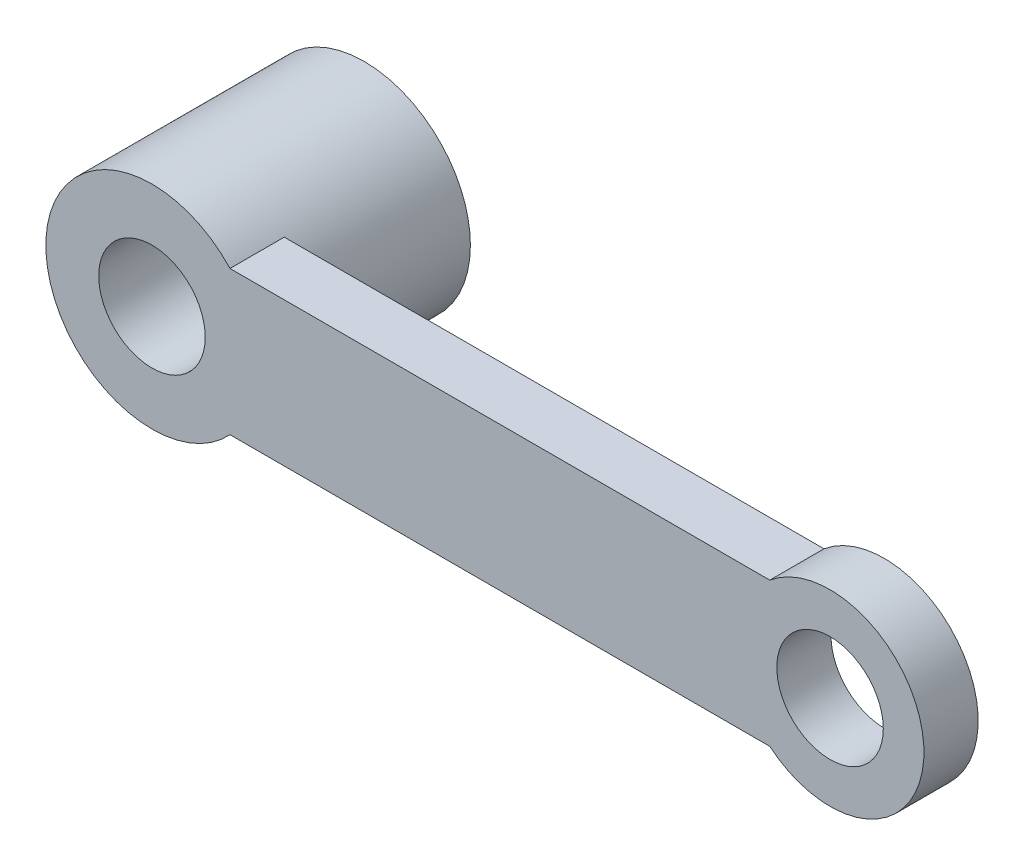
ISO-10303-21;
HEADER;
FILE_DESCRIPTION(('STEP AP214'),'2;1');
FILE_NAME('part.step','',(''),(''),'','','');
FILE_SCHEMA(('AUTOMOTIVE_DESIGN { 1 0 10303 214 1 1 1 1 }'));
ENDSEC;
DATA;
#1=APPLICATION_CONTEXT('core data for automotive mechanical design processes');
#2=APPLICATION_PROTOCOL_DEFINITION('international standard','automotive_design',2000,#1);
#3=PRODUCT_CONTEXT('',#1,'mechanical');
#4=PRODUCT('Part','Part','',(#3));
#5=PRODUCT_RELATED_PRODUCT_CATEGORY('part','',(#4));
#6=PRODUCT_DEFINITION_FORMATION('','',#4);
#7=PRODUCT_DEFINITION_CONTEXT('part definition',#1,'design');
#8=PRODUCT_DEFINITION('design','',#6,#7);
#9=PRODUCT_DEFINITION_SHAPE('','',#8);
#10=(LENGTH_UNIT() NAMED_UNIT(*) SI_UNIT(.MILLI.,.METRE.));
#11=(NAMED_UNIT(*) PLANE_ANGLE_UNIT() SI_UNIT($,.RADIAN.));
#12=(NAMED_UNIT(*) SI_UNIT($,.STERADIAN.) SOLID_ANGLE_UNIT());
#13=UNCERTAINTY_MEASURE_WITH_UNIT(LENGTH_MEASURE(1.E-05),#10,'distance_accuracy_value','');
#14=(GEOMETRIC_REPRESENTATION_CONTEXT(3) GLOBAL_UNCERTAINTY_ASSIGNED_CONTEXT((#13)) GLOBAL_UNIT_ASSIGNED_CONTEXT((#10,
#11,#12)) REPRESENTATION_CONTEXT('',''));
#15=CARTESIAN_POINT('',(0.,0.,0.));
#16=DIRECTION('',(0.,0.,1.));
#17=DIRECTION('',(1.,0.,0.));
#18=AXIS2_PLACEMENT_3D('',#15,#16,#17);
#19=CARTESIAN_POINT('',(0.,6.9,5.2));
#20=DIRECTION('',(0.,1.,0.));
#21=DIRECTION('',(-1.,0.,0.));
#22=AXIS2_PLACEMENT_3D('',#19,#20,#21);
#23=PLANE('',#22);
#24=DIRECTION('',(1.,0.,0.));
#25=VECTOR('',#24,1.);
#26=CARTESIAN_POINT('',(0.,6.9,0.));
#27=LINE('',#26,#25);
#28=CARTESIAN_POINT('',(7.47800942764851,6.9,0.));
#29=VERTEX_POINT('',#28);
#30=CARTESIAN_POINT('',(59.2215919147225,6.9,0.));
#31=VERTEX_POINT('',#30);
#32=EDGE_CURVE('E153',#29,#31,#27,.T.);
#33=ORIENTED_EDGE('',*,*,#32,.F.);
#34=DIRECTION('',(0.,0.,-1.));
#35=VECTOR('',#34,1.);
#36=CARTESIAN_POINT('',(7.47800942764851,6.9,5.2));
#37=LINE('',#36,#35);
#38=CARTESIAN_POINT('',(7.47800942764851,6.9,5.2));
#39=VERTEX_POINT('',#38);
#40=EDGE_CURVE('E140',#39,#29,#37,.T.);
#41=ORIENTED_EDGE('',*,*,#40,.F.);
#42=DIRECTION('',(1.,0.,0.));
#43=VECTOR('',#42,1.);
#44=CARTESIAN_POINT('',(0.,6.9,5.2));
#45=LINE('',#44,#43);
#46=CARTESIAN_POINT('',(59.2215919147225,6.9,5.2));
#47=VERTEX_POINT('',#46);
#48=EDGE_CURVE('E152',#39,#47,#45,.T.);
#49=ORIENTED_EDGE('',*,*,#48,.T.);
#50=DIRECTION('',(0.,0.,-1.));
#51=VECTOR('',#50,1.);
#52=CARTESIAN_POINT('',(59.2215919147225,6.9,5.2));
#53=LINE('',#52,#51);
#54=EDGE_CURVE('E100',#47,#31,#53,.T.);
#55=ORIENTED_EDGE('',*,*,#54,.T.);
#56=EDGE_LOOP('',(#33,#41,#49,#55));
#57=FACE_BOUND('',#56,.T.);
#58=ADVANCED_FACE('F89',(#57),#23,.T.);
#59=CARTESIAN_POINT('',(0.,-6.9,5.2));
#60=DIRECTION('',(0.,1.,0.));
#61=DIRECTION('',(-1.,0.,0.));
#62=AXIS2_PLACEMENT_3D('',#59,#60,#61);
#63=PLANE('',#62);
#64=DIRECTION('',(1.,0.,0.));
#65=VECTOR('',#64,1.);
#66=CARTESIAN_POINT('',(0.,-6.9,0.));
#67=LINE('',#66,#65);
#68=CARTESIAN_POINT('',(7.47800942764851,-6.9,0.));
#69=VERTEX_POINT('',#68);
#70=CARTESIAN_POINT('',(59.2215919147225,-6.9,0.));
#71=VERTEX_POINT('',#70);
#72=EDGE_CURVE('E143',#69,#71,#67,.T.);
#73=ORIENTED_EDGE('',*,*,#72,.T.);
#74=DIRECTION('',(0.,0.,-1.));
#75=VECTOR('',#74,1.);
#76=CARTESIAN_POINT('',(59.2215919147225,-6.9,5.2));
#77=LINE('',#76,#75);
#78=CARTESIAN_POINT('',(59.2215919147225,-6.9,5.2));
#79=VERTEX_POINT('',#78);
#80=EDGE_CURVE('E109',#79,#71,#77,.T.);
#81=ORIENTED_EDGE('',*,*,#80,.F.);
#82=DIRECTION('',(1.,0.,0.));
#83=VECTOR('',#82,1.);
#84=CARTESIAN_POINT('',(0.,-6.9,5.2));
#85=LINE('',#84,#83);
#86=CARTESIAN_POINT('',(7.47800942764851,-6.9,5.2));
#87=VERTEX_POINT('',#86);
#88=EDGE_CURVE('E145',#87,#79,#85,.T.);
#89=ORIENTED_EDGE('',*,*,#88,.F.);
#90=DIRECTION('',(0.,0.,-1.));
#91=VECTOR('',#90,1.);
#92=CARTESIAN_POINT('',(7.47800942764851,-6.9,5.2));
#93=LINE('',#92,#91);
#94=EDGE_CURVE('E138',#87,#69,#93,.T.);
#95=ORIENTED_EDGE('',*,*,#94,.T.);
#96=EDGE_LOOP('',(#73,#81,#89,#95));
#97=FACE_BOUND('',#96,.T.);
#98=ADVANCED_FACE('F142',(#97),#63,.F.);
#99=CARTESIAN_POINT('',(0.,0.,0.));
#100=DIRECTION('',(0.,0.,1.));
#101=DIRECTION('',(1.,0.,0.));
#102=AXIS2_PLACEMENT_3D('',#99,#100,#101);
#103=PLANE('',#102);
#104=ORIENTED_EDGE('',*,*,#72,.F.);
#105=CARTESIAN_POINT('',(0.,0.,0.));
#106=DIRECTION('',(0.,0.,1.));
#107=DIRECTION('',(1.,0.,0.));
#108=AXIS2_PLACEMENT_3D('',#105,#106,#107);
#109=CIRCLE('',#108,10.175);
#110=EDGE_CURVE('E12',#69,#29,#109,.T.);
#111=ORIENTED_EDGE('',*,*,#110,.T.);
#112=ORIENTED_EDGE('',*,*,#32,.T.);
#113=CARTESIAN_POINT('',(65.,0.,0.));
#114=DIRECTION('',(0.,0.,1.));
#115=DIRECTION('',(1.,0.,0.));
#116=AXIS2_PLACEMENT_3D('',#113,#114,#115);
#117=CIRCLE('',#116,9.);
#118=EDGE_CURVE('E150',#71,#31,#117,.T.);
#119=ORIENTED_EDGE('',*,*,#118,.F.);
#120=EDGE_LOOP('',(#104,#111,#112,#119));
#121=FACE_BOUND('',#120,.T.);
#122=CARTESIAN_POINT('',(65.,0.,0.));
#123=DIRECTION('',(0.,0.,1.));
#124=DIRECTION('',(1.,0.,0.));
#125=AXIS2_PLACEMENT_3D('',#122,#123,#124);
#126=CIRCLE('',#125,5.105);
#127=CARTESIAN_POINT('',(70.105,0.,0.));
#128=VERTEX_POINT('',#127);
#129=EDGE_CURVE('E173',#128,#128,#126,.T.);
#130=ORIENTED_EDGE('',*,*,#129,.T.);
#131=EDGE_LOOP('',(#130));
#132=FACE_BOUND('',#131,.T.);
#133=ADVANCED_FACE('F148',(#121,#132),#103,.F.);
#134=CARTESIAN_POINT('',(0.,0.,5.2));
#135=DIRECTION('',(0.,0.,1.));
#136=DIRECTION('',(1.,0.,0.));
#137=AXIS2_PLACEMENT_3D('',#134,#135,#136);
#138=PLANE('',#137);
#139=ORIENTED_EDGE('',*,*,#88,.T.);
#140=CARTESIAN_POINT('',(65.,0.,5.2));
#141=DIRECTION('',(0.,0.,1.));
#142=DIRECTION('',(1.,0.,0.));
#143=AXIS2_PLACEMENT_3D('',#140,#141,#142);
#144=CIRCLE('',#143,9.);
#145=EDGE_CURVE('E159',#79,#47,#144,.T.);
#146=ORIENTED_EDGE('',*,*,#145,.T.);
#147=ORIENTED_EDGE('',*,*,#48,.F.);
#148=CARTESIAN_POINT('',(0.,0.,5.2));
#149=DIRECTION('',(0.,0.,1.));
#150=DIRECTION('',(1.,0.,0.));
#151=AXIS2_PLACEMENT_3D('',#148,#149,#150);
#152=CIRCLE('',#151,10.175);
#153=EDGE_CURVE('E93',#39,#87,#152,.T.);
#154=ORIENTED_EDGE('',*,*,#153,.T.);
#155=EDGE_LOOP('',(#139,#146,#147,#154));
#156=FACE_BOUND('',#155,.T.);
#157=CARTESIAN_POINT('',(0.,0.,5.2));
#158=DIRECTION('',(0.,0.,1.));
#159=DIRECTION('',(1.,0.,0.));
#160=AXIS2_PLACEMENT_3D('',#157,#158,#159);
#161=CIRCLE('',#160,5.105);
#162=CARTESIAN_POINT('',(5.105,0.,5.2));
#163=VERTEX_POINT('',#162);
#164=EDGE_CURVE('E180',#163,#163,#161,.T.);
#165=ORIENTED_EDGE('',*,*,#164,.F.);
#166=EDGE_LOOP('',(#165));
#167=FACE_BOUND('',#166,.T.);
#168=CARTESIAN_POINT('',(65.,0.,5.2));
#169=DIRECTION('',(0.,0.,1.));
#170=DIRECTION('',(1.,0.,0.));
#171=AXIS2_PLACEMENT_3D('',#168,#169,#170);
#172=CIRCLE('',#171,5.105);
#173=CARTESIAN_POINT('',(70.105,0.,5.2));
#174=VERTEX_POINT('',#173);
#175=EDGE_CURVE('E169',#174,#174,#172,.T.);
#176=ORIENTED_EDGE('',*,*,#175,.F.);
#177=EDGE_LOOP('',(#176));
#178=FACE_BOUND('',#177,.T.);
#179=ADVANCED_FACE('F197',(#156,#167,#178),#138,.T.);
#180=CARTESIAN_POINT('',(0.,0.,5.2));
#181=DIRECTION('',(0.,0.,-1.));
#182=DIRECTION('',(-1.,0.,0.));
#183=AXIS2_PLACEMENT_3D('',#180,#181,#182);
#184=CYLINDRICAL_SURFACE('',#183,5.105);
#185=ORIENTED_EDGE('',*,*,#164,.T.);
#186=EDGE_LOOP('',(#185));
#187=FACE_BOUND('',#186,.T.);
#188=CARTESIAN_POINT('',(0.,0.,-15.15));
#189=DIRECTION('',(0.,0.,1.));
#190=DIRECTION('',(1.,0.,0.));
#191=AXIS2_PLACEMENT_3D('',#188,#189,#190);
#192=CIRCLE('',#191,5.105);
#193=CARTESIAN_POINT('',(5.105,0.,-15.15));
#194=VERTEX_POINT('',#193);
#195=EDGE_CURVE('E189',#194,#194,#192,.T.);
#196=ORIENTED_EDGE('',*,*,#195,.F.);
#197=EDGE_LOOP('',(#196));
#198=FACE_BOUND('',#197,.T.);
#199=ADVANCED_FACE('F206',(#187,#198),#184,.F.);
#200=CARTESIAN_POINT('',(0.,0.,5.2));
#201=DIRECTION('',(0.,0.,-1.));
#202=DIRECTION('',(-1.,0.,0.));
#203=AXIS2_PLACEMENT_3D('',#200,#201,#202);
#204=CYLINDRICAL_SURFACE('',#203,10.175);
#205=ORIENTED_EDGE('',*,*,#153,.F.);
#206=ORIENTED_EDGE('',*,*,#40,.T.);
#207=ORIENTED_EDGE('',*,*,#110,.F.);
#208=ORIENTED_EDGE('',*,*,#94,.F.);
#209=EDGE_LOOP('',(#205,#206,#207,#208));
#210=FACE_BOUND('',#209,.T.);
#211=CARTESIAN_POINT('',(0.,0.,-15.15));
#212=DIRECTION('',(0.,0.,1.));
#213=DIRECTION('',(1.,0.,0.));
#214=AXIS2_PLACEMENT_3D('',#211,#212,#213);
#215=CIRCLE('',#214,10.175);
#216=CARTESIAN_POINT('',(10.175,0.,-15.15));
#217=VERTEX_POINT('',#216);
#218=EDGE_CURVE('E183',#217,#217,#215,.T.);
#219=ORIENTED_EDGE('',*,*,#218,.T.);
#220=EDGE_LOOP('',(#219));
#221=FACE_BOUND('',#220,.T.);
#222=ADVANCED_FACE('F91',(#210,#221),#204,.T.);
#223=CARTESIAN_POINT('',(65.,0.,5.2));
#224=DIRECTION('',(0.,0.,-1.));
#225=DIRECTION('',(-1.,0.,0.));
#226=AXIS2_PLACEMENT_3D('',#223,#224,#225);
#227=CYLINDRICAL_SURFACE('',#226,5.105);
#228=ORIENTED_EDGE('',*,*,#175,.T.);
#229=EDGE_LOOP('',(#228));
#230=FACE_BOUND('',#229,.T.);
#231=ORIENTED_EDGE('',*,*,#129,.F.);
#232=EDGE_LOOP('',(#231));
#233=FACE_BOUND('',#232,.T.);
#234=ADVANCED_FACE('F204',(#230,#233),#227,.F.);
#235=CARTESIAN_POINT('',(65.,0.,5.2));
#236=DIRECTION('',(0.,0.,-1.));
#237=DIRECTION('',(-1.,0.,0.));
#238=AXIS2_PLACEMENT_3D('',#235,#236,#237);
#239=CYLINDRICAL_SURFACE('',#238,9.);
#240=ORIENTED_EDGE('',*,*,#54,.F.);
#241=ORIENTED_EDGE('',*,*,#145,.F.);
#242=ORIENTED_EDGE('',*,*,#80,.T.);
#243=ORIENTED_EDGE('',*,*,#118,.T.);
#244=EDGE_LOOP('',(#240,#241,#242,#243));
#245=FACE_BOUND('',#244,.T.);
#246=ADVANCED_FACE('F201',(#245),#239,.T.);
#247=CARTESIAN_POINT('',(0.,0.,-15.15));
#248=DIRECTION('',(0.,0.,1.));
#249=DIRECTION('',(1.,0.,0.));
#250=AXIS2_PLACEMENT_3D('',#247,#248,#249);
#251=PLANE('',#250);
#252=ORIENTED_EDGE('',*,*,#195,.T.);
#253=EDGE_LOOP('',(#252));
#254=FACE_BOUND('',#253,.T.);
#255=ORIENTED_EDGE('',*,*,#218,.F.);
#256=EDGE_LOOP('',(#255));
#257=FACE_BOUND('',#256,.T.);
#258=ADVANCED_FACE('F203',(#254,#257),#251,.F.);
#259=CLOSED_SHELL('',(#58,#98,#133,#179,#199,#222,#234,#246,#258));
#260=MANIFOLD_SOLID_BREP('B2',#259);
#261=ADVANCED_BREP_SHAPE_REPRESENTATION('',(#18,#260),#14);
#262=SHAPE_DEFINITION_REPRESENTATION(#9,#261);
ENDSEC;
END-ISO-10303-21;
